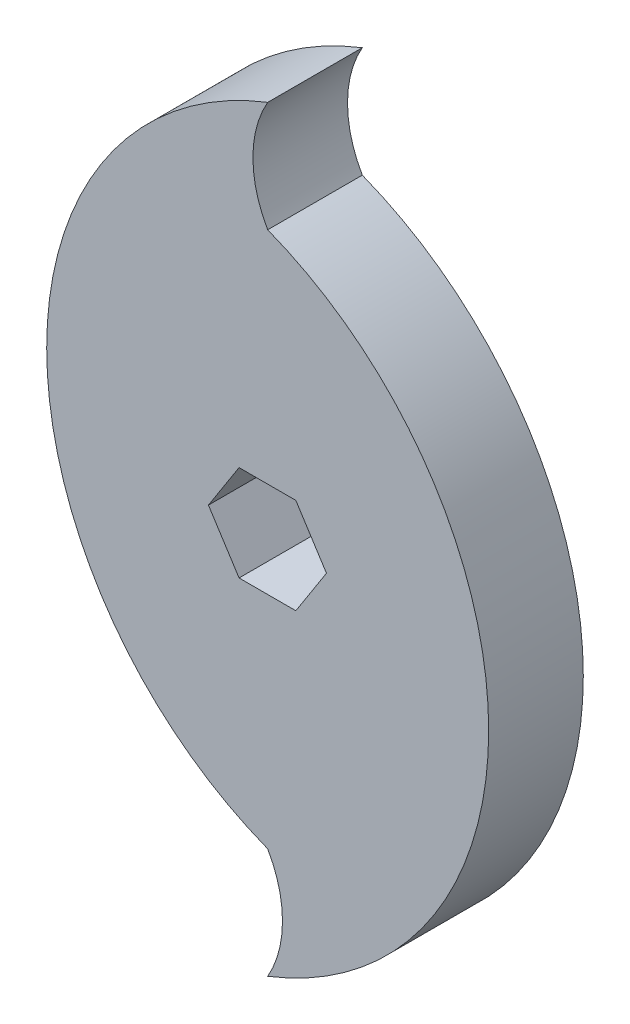
ISO-10303-21;
HEADER;
FILE_DESCRIPTION(('STEP AP214'),'2;1');
FILE_NAME('part.step','',(''),(''),'','','');
FILE_SCHEMA(('AUTOMOTIVE_DESIGN { 1 0 10303 214 1 1 1 1 }'));
ENDSEC;
DATA;
#1=APPLICATION_CONTEXT('core data for automotive mechanical design processes');
#2=APPLICATION_PROTOCOL_DEFINITION('international standard','automotive_design',2000,#1);
#3=PRODUCT_CONTEXT('',#1,'mechanical');
#4=PRODUCT('Part','Part','',(#3));
#5=PRODUCT_RELATED_PRODUCT_CATEGORY('part','',(#4));
#6=PRODUCT_DEFINITION_FORMATION('','',#4);
#7=PRODUCT_DEFINITION_CONTEXT('part definition',#1,'design');
#8=PRODUCT_DEFINITION('design','',#6,#7);
#9=PRODUCT_DEFINITION_SHAPE('','',#8);
#10=(LENGTH_UNIT() NAMED_UNIT(*) SI_UNIT(.MILLI.,.METRE.));
#11=(NAMED_UNIT(*) PLANE_ANGLE_UNIT() SI_UNIT($,.RADIAN.));
#12=(NAMED_UNIT(*) SI_UNIT($,.STERADIAN.) SOLID_ANGLE_UNIT());
#13=UNCERTAINTY_MEASURE_WITH_UNIT(LENGTH_MEASURE(1.E-05),#10,'distance_accuracy_value','');
#14=(GEOMETRIC_REPRESENTATION_CONTEXT(3) GLOBAL_UNCERTAINTY_ASSIGNED_CONTEXT((#13)) GLOBAL_UNIT_ASSIGNED_CONTEXT((#10,
#11,#12)) REPRESENTATION_CONTEXT('',''));
#15=CARTESIAN_POINT('',(0.,0.,0.));
#16=DIRECTION('',(0.,0.,1.));
#17=DIRECTION('',(1.,0.,0.));
#18=AXIS2_PLACEMENT_3D('',#15,#16,#17);
#19=CARTESIAN_POINT('',(30.3108891324554,-17.5,30.));
#20=DIRECTION('',(0.,0.,-1.));
#21=DIRECTION('',(-1.,0.,0.));
#22=AXIS2_PLACEMENT_3D('',#19,#20,#21);
#23=CYLINDRICAL_SURFACE('',#22,35.);
#24=CARTESIAN_POINT('',(30.3108891324554,-17.5,0.));
#25=DIRECTION('',(0.,0.,-1.));
#26=DIRECTION('',(-1.,0.,0.));
#27=AXIS2_PLACEMENT_3D('',#24,#25,#26);
#28=CIRCLE('',#27,35.);
#29=CARTESIAN_POINT('',(0.,-35.,0.));
#30=VERTEX_POINT('',#29);
#31=CARTESIAN_POINT('',(0.,0.,0.));
#32=VERTEX_POINT('',#31);
#33=EDGE_CURVE('E181',#30,#32,#28,.T.);
#34=ORIENTED_EDGE('',*,*,#33,.T.);
#35=DIRECTION('',(0.,0.,-1.));
#36=VECTOR('',#35,1.);
#37=CARTESIAN_POINT('',(0.,0.,30.));
#38=LINE('',#37,#36);
#39=CARTESIAN_POINT('',(0.,0.,30.));
#40=VERTEX_POINT('',#39);
#41=EDGE_CURVE('E11',#40,#32,#38,.T.);
#42=ORIENTED_EDGE('',*,*,#41,.F.);
#43=CARTESIAN_POINT('',(30.3108891324554,-17.5,30.));
#44=DIRECTION('',(0.,0.,-1.));
#45=DIRECTION('',(-1.,0.,0.));
#46=AXIS2_PLACEMENT_3D('',#43,#44,#45);
#47=CIRCLE('',#46,35.);
#48=CARTESIAN_POINT('',(0.,-35.,30.));
#49=VERTEX_POINT('',#48);
#50=EDGE_CURVE('E193',#49,#40,#47,.T.);
#51=ORIENTED_EDGE('',*,*,#50,.F.);
#52=DIRECTION('',(0.,0.,-1.));
#53=VECTOR('',#52,1.);
#54=CARTESIAN_POINT('',(0.,-35.,30.));
#55=LINE('',#54,#53);
#56=EDGE_CURVE('E207',#49,#30,#55,.T.);
#57=ORIENTED_EDGE('',*,*,#56,.T.);
#58=EDGE_LOOP('',(#34,#42,#51,#57));
#59=FACE_BOUND('',#58,.T.);
#60=ADVANCED_FACE('F45',(#59),#23,.F.);
#61=CARTESIAN_POINT('',(39.9217985566783,-102.5,30.));
#62=DIRECTION('',(0.,0.,-1.));
#63=DIRECTION('',(-1.,0.,0.));
#64=AXIS2_PLACEMENT_3D('',#61,#62,#63);
#65=CYLINDRICAL_SURFACE('',#64,110.);
#66=CARTESIAN_POINT('',(39.9217985566783,-102.5,0.));
#67=DIRECTION('',(0.,0.,1.));
#68=DIRECTION('',(-1.,0.,0.));
#69=AXIS2_PLACEMENT_3D('',#66,#67,#68);
#70=CIRCLE('',#69,110.);
#71=CARTESIAN_POINT('',(0.,-205.,0.));
#72=VERTEX_POINT('',#71);
#73=EDGE_CURVE('E211',#32,#72,#70,.T.);
#74=ORIENTED_EDGE('',*,*,#73,.T.);
#75=DIRECTION('',(0.,0.,-1.));
#76=VECTOR('',#75,1.);
#77=CARTESIAN_POINT('',(0.,-205.,30.));
#78=LINE('',#77,#76);
#79=CARTESIAN_POINT('',(0.,-205.,30.));
#80=VERTEX_POINT('',#79);
#81=EDGE_CURVE('E53',#80,#72,#78,.T.);
#82=ORIENTED_EDGE('',*,*,#81,.F.);
#83=CARTESIAN_POINT('',(39.9217985566783,-102.5,30.));
#84=DIRECTION('',(0.,0.,1.));
#85=DIRECTION('',(-1.,0.,0.));
#86=AXIS2_PLACEMENT_3D('',#83,#84,#85);
#87=CIRCLE('',#86,110.);
#88=EDGE_CURVE('E197',#40,#80,#87,.T.);
#89=ORIENTED_EDGE('',*,*,#88,.F.);
#90=ORIENTED_EDGE('',*,*,#41,.T.);
#91=EDGE_LOOP('',(#74,#82,#89,#90));
#92=FACE_BOUND('',#91,.T.);
#93=ADVANCED_FACE('F245',(#92),#65,.T.);
#94=CARTESIAN_POINT('',(-30.3108891324553,-222.5,30.));
#95=DIRECTION('',(0.,0.,-1.));
#96=DIRECTION('',(-1.,0.,0.));
#97=AXIS2_PLACEMENT_3D('',#94,#95,#96);
#98=CYLINDRICAL_SURFACE('',#97,35.);
#99=CARTESIAN_POINT('',(-30.3108891324553,-222.5,0.));
#100=DIRECTION('',(0.,0.,-1.));
#101=DIRECTION('',(-1.,0.,0.));
#102=AXIS2_PLACEMENT_3D('',#99,#100,#101);
#103=CIRCLE('',#102,35.);
#104=CARTESIAN_POINT('',(0.,-240.,0.));
#105=VERTEX_POINT('',#104);
#106=EDGE_CURVE('E214',#72,#105,#103,.T.);
#107=ORIENTED_EDGE('',*,*,#106,.T.);
#108=DIRECTION('',(0.,0.,-1.));
#109=VECTOR('',#108,1.);
#110=CARTESIAN_POINT('',(0.,-240.,30.));
#111=LINE('',#110,#109);
#112=CARTESIAN_POINT('',(0.,-240.,30.));
#113=VERTEX_POINT('',#112);
#114=EDGE_CURVE('E222',#113,#105,#111,.T.);
#115=ORIENTED_EDGE('',*,*,#114,.F.);
#116=CARTESIAN_POINT('',(-30.3108891324553,-222.5,30.));
#117=DIRECTION('',(0.,0.,-1.));
#118=DIRECTION('',(-1.,0.,0.));
#119=AXIS2_PLACEMENT_3D('',#116,#117,#118);
#120=CIRCLE('',#119,35.);
#121=EDGE_CURVE('E201',#80,#113,#120,.T.);
#122=ORIENTED_EDGE('',*,*,#121,.F.);
#123=ORIENTED_EDGE('',*,*,#81,.T.);
#124=EDGE_LOOP('',(#107,#115,#122,#123));
#125=FACE_BOUND('',#124,.T.);
#126=ADVANCED_FACE('F231',(#125),#98,.F.);
#127=CARTESIAN_POINT('',(-39.9217985566783,-137.5,30.));
#128=DIRECTION('',(0.,0.,-1.));
#129=DIRECTION('',(-1.,0.,0.));
#130=AXIS2_PLACEMENT_3D('',#127,#128,#129);
#131=CYLINDRICAL_SURFACE('',#130,110.);
#132=CARTESIAN_POINT('',(-39.9217985566783,-137.5,0.));
#133=DIRECTION('',(0.,0.,1.));
#134=DIRECTION('',(-1.,0.,0.));
#135=AXIS2_PLACEMENT_3D('',#132,#133,#134);
#136=CIRCLE('',#135,110.);
#137=EDGE_CURVE('E198',#105,#30,#136,.T.);
#138=ORIENTED_EDGE('',*,*,#137,.T.);
#139=ORIENTED_EDGE('',*,*,#56,.F.);
#140=CARTESIAN_POINT('',(-39.9217985566783,-137.5,30.));
#141=DIRECTION('',(0.,0.,1.));
#142=DIRECTION('',(-1.,0.,0.));
#143=AXIS2_PLACEMENT_3D('',#140,#141,#142);
#144=CIRCLE('',#143,110.);
#145=EDGE_CURVE('E204',#113,#49,#144,.T.);
#146=ORIENTED_EDGE('',*,*,#145,.F.);
#147=ORIENTED_EDGE('',*,*,#114,.T.);
#148=EDGE_LOOP('',(#138,#139,#146,#147));
#149=FACE_BOUND('',#148,.T.);
#150=ADVANCED_FACE('F238',(#149),#131,.T.);
#151=CARTESIAN_POINT('',(35.1163438445668,-60.,30.));
#152=DIRECTION('',(0.,0.,-1.));
#153=DIRECTION('',(-1.,0.,0.));
#154=AXIS2_PLACEMENT_3D('',#151,#152,#153);
#155=PLANE('',#154);
#156=DIRECTION('',(0.539685869959561,-0.841866475022015,0.));
#157=VECTOR('',#156,1.);
#158=CARTESIAN_POINT('',(-9.07820144332169,-135.153596550396,30.));
#159=LINE('',#158,#157);
#160=CARTESIAN_POINT('',(-18.7925471025938,-120.,30.));
#161=VERTEX_POINT('',#160);
#162=CARTESIAN_POINT('',(-9.07820144332169,-135.153596550396,30.));
#163=VERTEX_POINT('',#162);
#164=EDGE_CURVE('E164',#161,#163,#159,.T.);
#165=ORIENTED_EDGE('',*,*,#164,.F.);
#166=DIRECTION('',(-0.539685869959562,-0.841866475022014,0.));
#167=VECTOR('',#166,1.);
#168=CARTESIAN_POINT('',(-18.7925471025938,-120.,30.));
#169=LINE('',#168,#167);
#170=CARTESIAN_POINT('',(-9.07820144332168,-104.846403449604,30.));
#171=VERTEX_POINT('',#170);
#172=EDGE_CURVE('E60',#171,#161,#169,.T.);
#173=ORIENTED_EDGE('',*,*,#172,.F.);
#174=DIRECTION('',(-1.,0.,0.));
#175=VECTOR('',#174,1.);
#176=CARTESIAN_POINT('',(-9.07820144332168,-104.846403449604,30.));
#177=LINE('',#176,#175);
#178=CARTESIAN_POINT('',(8.92179855667831,-104.846403449604,30.));
#179=VERTEX_POINT('',#178);
#180=EDGE_CURVE('E144',#179,#171,#177,.T.);
#181=ORIENTED_EDGE('',*,*,#180,.F.);
#182=DIRECTION('',(-0.539685869959561,0.841866475022014,0.));
#183=VECTOR('',#182,1.);
#184=CARTESIAN_POINT('',(8.92179855667831,-104.846403449604,30.));
#185=LINE('',#184,#183);
#186=CARTESIAN_POINT('',(18.6361442159504,-120.,30.));
#187=VERTEX_POINT('',#186);
#188=EDGE_CURVE('E148',#187,#179,#185,.T.);
#189=ORIENTED_EDGE('',*,*,#188,.F.);
#190=DIRECTION('',(0.539685869959561,0.841866475022014,0.));
#191=VECTOR('',#190,1.);
#192=CARTESIAN_POINT('',(18.6361442159504,-120.,30.));
#193=LINE('',#192,#191);
#194=CARTESIAN_POINT('',(8.92179855667831,-135.153596550396,30.));
#195=VERTEX_POINT('',#194);
#196=EDGE_CURVE('E171',#195,#187,#193,.T.);
#197=ORIENTED_EDGE('',*,*,#196,.F.);
#198=DIRECTION('',(1.,0.,0.));
#199=VECTOR('',#198,1.);
#200=CARTESIAN_POINT('',(8.92179855667831,-135.153596550396,30.));
#201=LINE('',#200,#199);
#202=EDGE_CURVE('E167',#163,#195,#201,.T.);
#203=ORIENTED_EDGE('',*,*,#202,.F.);
#204=EDGE_LOOP('',(#165,#173,#181,#189,#197,#203));
#205=FACE_BOUND('',#204,.T.);
#206=ORIENTED_EDGE('',*,*,#50,.T.);
#207=ORIENTED_EDGE('',*,*,#88,.T.);
#208=ORIENTED_EDGE('',*,*,#121,.T.);
#209=ORIENTED_EDGE('',*,*,#145,.T.);
#210=EDGE_LOOP('',(#206,#207,#208,#209));
#211=FACE_BOUND('',#210,.T.);
#212=ADVANCED_FACE('F244',(#205,#211),#155,.F.);
#213=CARTESIAN_POINT('',(35.1163438445668,-60.,0.));
#214=DIRECTION('',(0.,0.,-1.));
#215=DIRECTION('',(-1.,0.,0.));
#216=AXIS2_PLACEMENT_3D('',#213,#214,#215);
#217=PLANE('',#216);
#218=DIRECTION('',(-0.539685869959562,-0.841866475022014,0.));
#219=VECTOR('',#218,1.);
#220=CARTESIAN_POINT('',(-18.7925471025938,-120.,0.));
#221=LINE('',#220,#219);
#222=CARTESIAN_POINT('',(-9.07820144332168,-104.846403449604,0.));
#223=VERTEX_POINT('',#222);
#224=CARTESIAN_POINT('',(-18.7925471025938,-120.,0.));
#225=VERTEX_POINT('',#224);
#226=EDGE_CURVE('E124',#223,#225,#221,.T.);
#227=ORIENTED_EDGE('',*,*,#226,.T.);
#228=DIRECTION('',(0.539685869959561,-0.841866475022015,0.));
#229=VECTOR('',#228,1.);
#230=CARTESIAN_POINT('',(-9.07820144332169,-135.153596550396,0.));
#231=LINE('',#230,#229);
#232=CARTESIAN_POINT('',(-9.07820144332168,-135.153596550396,0.));
#233=VERTEX_POINT('',#232);
#234=EDGE_CURVE('E134',#225,#233,#231,.T.);
#235=ORIENTED_EDGE('',*,*,#234,.T.);
#236=DIRECTION('',(1.,0.,0.));
#237=VECTOR('',#236,1.);
#238=CARTESIAN_POINT('',(8.92179855667831,-135.153596550396,0.));
#239=LINE('',#238,#237);
#240=CARTESIAN_POINT('',(8.92179855667831,-135.153596550396,0.));
#241=VERTEX_POINT('',#240);
#242=EDGE_CURVE('E68',#233,#241,#239,.T.);
#243=ORIENTED_EDGE('',*,*,#242,.T.);
#244=DIRECTION('',(0.539685869959561,0.841866475022014,0.));
#245=VECTOR('',#244,1.);
#246=CARTESIAN_POINT('',(18.6361442159504,-120.,0.));
#247=LINE('',#246,#245);
#248=CARTESIAN_POINT('',(18.6361442159504,-120.,0.));
#249=VERTEX_POINT('',#248);
#250=EDGE_CURVE('E153',#241,#249,#247,.T.);
#251=ORIENTED_EDGE('',*,*,#250,.T.);
#252=DIRECTION('',(-0.539685869959561,0.841866475022014,0.));
#253=VECTOR('',#252,1.);
#254=CARTESIAN_POINT('',(8.92179855667831,-104.846403449604,0.));
#255=LINE('',#254,#253);
#256=CARTESIAN_POINT('',(8.92179855667831,-104.846403449604,0.));
#257=VERTEX_POINT('',#256);
#258=EDGE_CURVE('E157',#249,#257,#255,.T.);
#259=ORIENTED_EDGE('',*,*,#258,.T.);
#260=DIRECTION('',(-1.,0.,0.));
#261=VECTOR('',#260,1.);
#262=CARTESIAN_POINT('',(-9.07820144332168,-104.846403449604,0.));
#263=LINE('',#262,#261);
#264=EDGE_CURVE('E131',#257,#223,#263,.T.);
#265=ORIENTED_EDGE('',*,*,#264,.T.);
#266=EDGE_LOOP('',(#227,#235,#243,#251,#259,#265));
#267=FACE_BOUND('',#266,.T.);
#268=ORIENTED_EDGE('',*,*,#33,.F.);
#269=ORIENTED_EDGE('',*,*,#137,.F.);
#270=ORIENTED_EDGE('',*,*,#106,.F.);
#271=ORIENTED_EDGE('',*,*,#73,.F.);
#272=EDGE_LOOP('',(#268,#269,#270,#271));
#273=FACE_BOUND('',#272,.T.);
#274=ADVANCED_FACE('F139',(#267,#273),#217,.T.);
#275=CARTESIAN_POINT('',(-18.7925471025938,-120.,0.));
#276=DIRECTION('',(-0.841866475022014,0.539685869959562,0.));
#277=DIRECTION('',(-0.539685869959562,-0.841866475022014,0.));
#278=AXIS2_PLACEMENT_3D('',#275,#276,#277);
#279=PLANE('',#278);
#280=ORIENTED_EDGE('',*,*,#172,.T.);
#281=DIRECTION('',(0.,0.,1.));
#282=VECTOR('',#281,1.);
#283=CARTESIAN_POINT('',(-18.7925471025938,-120.,0.));
#284=LINE('',#283,#282);
#285=EDGE_CURVE('E120',#225,#161,#284,.T.);
#286=ORIENTED_EDGE('',*,*,#285,.F.);
#287=ORIENTED_EDGE('',*,*,#226,.F.);
#288=DIRECTION('',(0.,0.,1.));
#289=VECTOR('',#288,1.);
#290=CARTESIAN_POINT('',(-9.07820144332168,-104.846403449604,0.));
#291=LINE('',#290,#289);
#292=EDGE_CURVE('E178',#223,#171,#291,.T.);
#293=ORIENTED_EDGE('',*,*,#292,.T.);
#294=EDGE_LOOP('',(#280,#286,#287,#293));
#295=FACE_BOUND('',#294,.T.);
#296=ADVANCED_FACE('F122',(#295),#279,.F.);
#297=CARTESIAN_POINT('',(-9.07820144332168,-104.846403449604,0.));
#298=DIRECTION('',(0.,1.,0.));
#299=DIRECTION('',(-1.,0.,0.));
#300=AXIS2_PLACEMENT_3D('',#297,#298,#299);
#301=PLANE('',#300);
#302=ORIENTED_EDGE('',*,*,#180,.T.);
#303=ORIENTED_EDGE('',*,*,#292,.F.);
#304=ORIENTED_EDGE('',*,*,#264,.F.);
#305=DIRECTION('',(0.,0.,1.));
#306=VECTOR('',#305,1.);
#307=CARTESIAN_POINT('',(8.92179855667831,-104.846403449604,0.));
#308=LINE('',#307,#306);
#309=EDGE_CURVE('E182',#257,#179,#308,.T.);
#310=ORIENTED_EDGE('',*,*,#309,.T.);
#311=EDGE_LOOP('',(#302,#303,#304,#310));
#312=FACE_BOUND('',#311,.T.);
#313=ADVANCED_FACE('F262',(#312),#301,.F.);
#314=CARTESIAN_POINT('',(8.92179855667831,-104.846403449604,0.));
#315=DIRECTION('',(0.841866475022014,0.539685869959561,0.));
#316=DIRECTION('',(-0.539685869959561,0.841866475022014,0.));
#317=AXIS2_PLACEMENT_3D('',#314,#315,#316);
#318=PLANE('',#317);
#319=ORIENTED_EDGE('',*,*,#188,.T.);
#320=ORIENTED_EDGE('',*,*,#309,.F.);
#321=ORIENTED_EDGE('',*,*,#258,.F.);
#322=DIRECTION('',(0.,0.,1.));
#323=VECTOR('',#322,1.);
#324=CARTESIAN_POINT('',(18.6361442159504,-120.,0.));
#325=LINE('',#324,#323);
#326=EDGE_CURVE('E185',#249,#187,#325,.T.);
#327=ORIENTED_EDGE('',*,*,#326,.T.);
#328=EDGE_LOOP('',(#319,#320,#321,#327));
#329=FACE_BOUND('',#328,.T.);
#330=ADVANCED_FACE('F271',(#329),#318,.F.);
#331=CARTESIAN_POINT('',(18.6361442159504,-120.,0.));
#332=DIRECTION('',(0.841866475022014,-0.539685869959561,0.));
#333=DIRECTION('',(0.539685869959561,0.841866475022015,0.));
#334=AXIS2_PLACEMENT_3D('',#331,#332,#333);
#335=PLANE('',#334);
#336=ORIENTED_EDGE('',*,*,#196,.T.);
#337=ORIENTED_EDGE('',*,*,#326,.F.);
#338=ORIENTED_EDGE('',*,*,#250,.F.);
#339=DIRECTION('',(0.,0.,1.));
#340=VECTOR('',#339,1.);
#341=CARTESIAN_POINT('',(8.92179855667831,-135.153596550396,0.));
#342=LINE('',#341,#340);
#343=EDGE_CURVE('E188',#241,#195,#342,.T.);
#344=ORIENTED_EDGE('',*,*,#343,.T.);
#345=EDGE_LOOP('',(#336,#337,#338,#344));
#346=FACE_BOUND('',#345,.T.);
#347=ADVANCED_FACE('F268',(#346),#335,.F.);
#348=CARTESIAN_POINT('',(8.92179855667831,-135.153596550396,0.));
#349=DIRECTION('',(0.,-1.,0.));
#350=DIRECTION('',(0.,0.,-1.));
#351=AXIS2_PLACEMENT_3D('',#348,#349,#350);
#352=PLANE('',#351);
#353=ORIENTED_EDGE('',*,*,#202,.T.);
#354=ORIENTED_EDGE('',*,*,#343,.F.);
#355=ORIENTED_EDGE('',*,*,#242,.F.);
#356=DIRECTION('',(0.,0.,1.));
#357=VECTOR('',#356,1.);
#358=CARTESIAN_POINT('',(-9.07820144332169,-135.153596550396,0.));
#359=LINE('',#358,#357);
#360=EDGE_CURVE('E130',#233,#163,#359,.T.);
#361=ORIENTED_EDGE('',*,*,#360,.T.);
#362=EDGE_LOOP('',(#353,#354,#355,#361));
#363=FACE_BOUND('',#362,.T.);
#364=ADVANCED_FACE('F265',(#363),#352,.F.);
#365=CARTESIAN_POINT('',(-9.07820144332169,-135.153596550396,0.));
#366=DIRECTION('',(-0.841866475022015,-0.539685869959561,0.));
#367=DIRECTION('',(0.539685869959561,-0.841866475022015,0.));
#368=AXIS2_PLACEMENT_3D('',#365,#366,#367);
#369=PLANE('',#368);
#370=ORIENTED_EDGE('',*,*,#164,.T.);
#371=ORIENTED_EDGE('',*,*,#360,.F.);
#372=ORIENTED_EDGE('',*,*,#234,.F.);
#373=ORIENTED_EDGE('',*,*,#285,.T.);
#374=EDGE_LOOP('',(#370,#371,#372,#373));
#375=FACE_BOUND('',#374,.T.);
#376=ADVANCED_FACE('F135',(#375),#369,.F.);
#377=CLOSED_SHELL('',(#60,#93,#126,#150,#212,#274,#296,#313,#330,#347,#364,#376));
#378=MANIFOLD_SOLID_BREP('B2',#377);
#379=ADVANCED_BREP_SHAPE_REPRESENTATION('',(#18,#378),#14);
#380=SHAPE_DEFINITION_REPRESENTATION(#9,#379);
ENDSEC;
END-ISO-10303-21;
